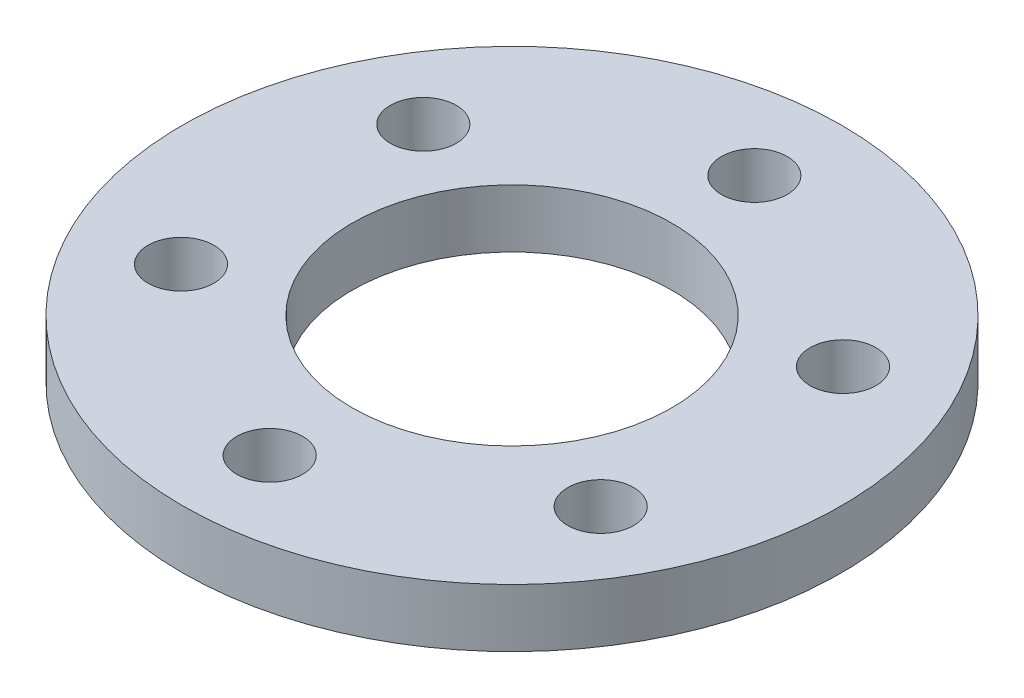
ISO-10303-21;
HEADER;
FILE_DESCRIPTION(('STEP AP214'),'2;1');
FILE_NAME('part.step','',(''),(''),'','','');
FILE_SCHEMA(('AUTOMOTIVE_DESIGN { 1 0 10303 214 1 1 1 1 }'));
ENDSEC;
DATA;
#1=APPLICATION_CONTEXT('core data for automotive mechanical design processes');
#2=APPLICATION_PROTOCOL_DEFINITION('international standard','automotive_design',2000,#1);
#3=PRODUCT_CONTEXT('',#1,'mechanical');
#4=PRODUCT('Part','Part','',(#3));
#5=PRODUCT_RELATED_PRODUCT_CATEGORY('part','',(#4));
#6=PRODUCT_DEFINITION_FORMATION('','',#4);
#7=PRODUCT_DEFINITION_CONTEXT('part definition',#1,'design');
#8=PRODUCT_DEFINITION('design','',#6,#7);
#9=PRODUCT_DEFINITION_SHAPE('','',#8);
#10=(LENGTH_UNIT() NAMED_UNIT(*) SI_UNIT(.MILLI.,.METRE.));
#11=(NAMED_UNIT(*) PLANE_ANGLE_UNIT() SI_UNIT($,.RADIAN.));
#12=(NAMED_UNIT(*) SI_UNIT($,.STERADIAN.) SOLID_ANGLE_UNIT());
#13=UNCERTAINTY_MEASURE_WITH_UNIT(LENGTH_MEASURE(1.E-05),#10,'distance_accuracy_value','');
#14=(GEOMETRIC_REPRESENTATION_CONTEXT(3) GLOBAL_UNCERTAINTY_ASSIGNED_CONTEXT((#13)) GLOBAL_UNIT_ASSIGNED_CONTEXT((#10,
#11,#12)) REPRESENTATION_CONTEXT('',''));
#15=CARTESIAN_POINT('',(0.,0.,0.));
#16=DIRECTION('',(0.,0.,1.));
#17=DIRECTION('',(1.,0.,0.));
#18=AXIS2_PLACEMENT_3D('',#15,#16,#17);
#19=CARTESIAN_POINT('',(0.,3.,0.));
#20=DIRECTION('',(0.,1.,0.));
#21=DIRECTION('',(0.,0.,1.));
#22=AXIS2_PLACEMENT_3D('',#19,#20,#21);
#23=PLANE('',#22);
#24=CARTESIAN_POINT('',(-10.8253175473046,3.,6.25000000000052));
#25=DIRECTION('',(0.,1.,0.));
#26=DIRECTION('',(0.,0.,1.));
#27=AXIS2_PLACEMENT_3D('',#24,#25,#26);
#28=CIRCLE('',#27,1.7);
#29=CARTESIAN_POINT('',(-10.8253175473046,3.,7.95000000000052));
#30=VERTEX_POINT('',#29);
#31=EDGE_CURVE('E87',#30,#30,#28,.T.);
#32=ORIENTED_EDGE('',*,*,#31,.F.);
#33=EDGE_LOOP('',(#32));
#34=FACE_BOUND('',#33,.T.);
#35=CARTESIAN_POINT('',(10.8253175473064,3.,6.24999999999948));
#36=DIRECTION('',(0.,1.,0.));
#37=DIRECTION('',(0.,0.,1.));
#38=AXIS2_PLACEMENT_3D('',#35,#36,#37);
#39=CIRCLE('',#38,1.7);
#40=CARTESIAN_POINT('',(10.8253175473064,3.,7.94999999999948));
#41=VERTEX_POINT('',#40);
#42=EDGE_CURVE('E72',#41,#41,#39,.T.);
#43=ORIENTED_EDGE('',*,*,#42,.F.);
#44=EDGE_LOOP('',(#43));
#45=FACE_BOUND('',#44,.T.);
#46=CARTESIAN_POINT('',(0.,3.,-12.5));
#47=DIRECTION('',(0.,1.,0.));
#48=DIRECTION('',(0.,0.,1.));
#49=AXIS2_PLACEMENT_3D('',#46,#47,#48);
#50=CIRCLE('',#49,1.7);
#51=CARTESIAN_POINT('',(0.,3.,-10.8));
#52=VERTEX_POINT('',#51);
#53=EDGE_CURVE('E56',#52,#52,#50,.T.);
#54=ORIENTED_EDGE('',*,*,#53,.F.);
#55=EDGE_LOOP('',(#54));
#56=FACE_BOUND('',#55,.T.);
#57=CARTESIAN_POINT('',(0.,3.,0.));
#58=DIRECTION('',(0.,1.,0.));
#59=DIRECTION('',(0.,0.,1.));
#60=AXIS2_PLACEMENT_3D('',#57,#58,#59);
#61=CIRCLE('',#60,17.);
#62=CARTESIAN_POINT('',(0.,3.,17.));
#63=VERTEX_POINT('',#62);
#64=EDGE_CURVE('E10',#63,#63,#61,.T.);
#65=ORIENTED_EDGE('',*,*,#64,.T.);
#66=EDGE_LOOP('',(#65));
#67=FACE_BOUND('',#66,.T.);
#68=CARTESIAN_POINT('',(0.,3.,0.));
#69=DIRECTION('',(0.,1.,0.));
#70=DIRECTION('',(0.,0.,1.));
#71=AXIS2_PLACEMENT_3D('',#68,#69,#70);
#72=CIRCLE('',#71,8.25);
#73=CARTESIAN_POINT('',(0.,3.,8.25));
#74=VERTEX_POINT('',#73);
#75=EDGE_CURVE('E50',#74,#74,#72,.T.);
#76=ORIENTED_EDGE('',*,*,#75,.F.);
#77=EDGE_LOOP('',(#76));
#78=FACE_BOUND('',#77,.T.);
#79=CARTESIAN_POINT('',(10.8253175473058,3.,-6.25000000000052));
#80=DIRECTION('',(0.,1.,0.));
#81=DIRECTION('',(0.,0.,1.));
#82=AXIS2_PLACEMENT_3D('',#79,#80,#81);
#83=CIRCLE('',#82,1.7);
#84=CARTESIAN_POINT('',(10.8253175473058,3.,-4.55000000000052));
#85=VERTEX_POINT('',#84);
#86=EDGE_CURVE('E64',#85,#85,#83,.T.);
#87=ORIENTED_EDGE('',*,*,#86,.F.);
#88=EDGE_LOOP('',(#87));
#89=FACE_BOUND('',#88,.T.);
#90=CARTESIAN_POINT('',(1.18838458250068E-12,3.,12.5));
#91=DIRECTION('',(0.,1.,0.));
#92=DIRECTION('',(0.,0.,1.));
#93=AXIS2_PLACEMENT_3D('',#90,#91,#92);
#94=CIRCLE('',#93,1.7);
#95=CARTESIAN_POINT('',(1.18838458250068E-12,3.,14.2));
#96=VERTEX_POINT('',#95);
#97=EDGE_CURVE('E80',#96,#96,#94,.T.);
#98=ORIENTED_EDGE('',*,*,#97,.F.);
#99=EDGE_LOOP('',(#98));
#100=FACE_BOUND('',#99,.T.);
#101=CARTESIAN_POINT('',(-10.8253175473052,3.,-6.24999999999948));
#102=DIRECTION('',(0.,1.,0.));
#103=DIRECTION('',(0.,0.,1.));
#104=AXIS2_PLACEMENT_3D('',#101,#102,#103);
#105=CIRCLE('',#104,1.7);
#106=CARTESIAN_POINT('',(-10.8253175473052,3.,-4.54999999999948));
#107=VERTEX_POINT('',#106);
#108=EDGE_CURVE('E94',#107,#107,#105,.T.);
#109=ORIENTED_EDGE('',*,*,#108,.F.);
#110=EDGE_LOOP('',(#109));
#111=FACE_BOUND('',#110,.T.);
#112=ADVANCED_FACE('F35',(#34,#45,#56,#67,#78,#89,#100,#111),#23,.T.);
#113=CARTESIAN_POINT('',(0.,0.,0.));
#114=DIRECTION('',(0.,1.,0.));
#115=DIRECTION('',(0.,0.,1.));
#116=AXIS2_PLACEMENT_3D('',#113,#114,#115);
#117=PLANE('',#116);
#118=CARTESIAN_POINT('',(0.,0.,0.));
#119=DIRECTION('',(0.,1.,0.));
#120=DIRECTION('',(0.,0.,1.));
#121=AXIS2_PLACEMENT_3D('',#118,#119,#120);
#122=CIRCLE('',#121,17.);
#123=CARTESIAN_POINT('',(0.,0.,17.));
#124=VERTEX_POINT('',#123);
#125=EDGE_CURVE('E39',#124,#124,#122,.T.);
#126=ORIENTED_EDGE('',*,*,#125,.F.);
#127=EDGE_LOOP('',(#126));
#128=FACE_BOUND('',#127,.T.);
#129=CARTESIAN_POINT('',(0.,0.,0.));
#130=DIRECTION('',(0.,1.,0.));
#131=DIRECTION('',(0.,0.,1.));
#132=AXIS2_PLACEMENT_3D('',#129,#130,#131);
#133=CIRCLE('',#132,8.25);
#134=CARTESIAN_POINT('',(0.,0.,8.25));
#135=VERTEX_POINT('',#134);
#136=EDGE_CURVE('E52',#135,#135,#133,.T.);
#137=ORIENTED_EDGE('',*,*,#136,.T.);
#138=EDGE_LOOP('',(#137));
#139=FACE_BOUND('',#138,.T.);
#140=CARTESIAN_POINT('',(0.,0.,-12.5));
#141=DIRECTION('',(0.,1.,0.));
#142=DIRECTION('',(0.,0.,1.));
#143=AXIS2_PLACEMENT_3D('',#140,#141,#142);
#144=CIRCLE('',#143,1.7);
#145=CARTESIAN_POINT('',(0.,0.,-10.8));
#146=VERTEX_POINT('',#145);
#147=EDGE_CURVE('E60',#146,#146,#144,.T.);
#148=ORIENTED_EDGE('',*,*,#147,.T.);
#149=EDGE_LOOP('',(#148));
#150=FACE_BOUND('',#149,.T.);
#151=CARTESIAN_POINT('',(10.8253175473058,0.,-6.25000000000052));
#152=DIRECTION('',(0.,1.,0.));
#153=DIRECTION('',(0.,0.,1.));
#154=AXIS2_PLACEMENT_3D('',#151,#152,#153);
#155=CIRCLE('',#154,1.7);
#156=CARTESIAN_POINT('',(10.8253175473058,0.,-4.55000000000052));
#157=VERTEX_POINT('',#156);
#158=EDGE_CURVE('E68',#157,#157,#155,.T.);
#159=ORIENTED_EDGE('',*,*,#158,.T.);
#160=EDGE_LOOP('',(#159));
#161=FACE_BOUND('',#160,.T.);
#162=CARTESIAN_POINT('',(10.8253175473064,0.,6.24999999999948));
#163=DIRECTION('',(0.,1.,0.));
#164=DIRECTION('',(0.,0.,1.));
#165=AXIS2_PLACEMENT_3D('',#162,#163,#164);
#166=CIRCLE('',#165,1.7);
#167=CARTESIAN_POINT('',(10.8253175473064,0.,7.94999999999948));
#168=VERTEX_POINT('',#167);
#169=EDGE_CURVE('E76',#168,#168,#166,.T.);
#170=ORIENTED_EDGE('',*,*,#169,.T.);
#171=EDGE_LOOP('',(#170));
#172=FACE_BOUND('',#171,.T.);
#173=CARTESIAN_POINT('',(1.18838458250068E-12,0.,12.5));
#174=DIRECTION('',(0.,1.,0.));
#175=DIRECTION('',(0.,0.,1.));
#176=AXIS2_PLACEMENT_3D('',#173,#174,#175);
#177=CIRCLE('',#176,1.7);
#178=CARTESIAN_POINT('',(1.18838458250068E-12,0.,14.2));
#179=VERTEX_POINT('',#178);
#180=EDGE_CURVE('E84',#179,#179,#177,.T.);
#181=ORIENTED_EDGE('',*,*,#180,.T.);
#182=EDGE_LOOP('',(#181));
#183=FACE_BOUND('',#182,.T.);
#184=CARTESIAN_POINT('',(-10.8253175473046,0.,6.25000000000052));
#185=DIRECTION('',(0.,1.,0.));
#186=DIRECTION('',(0.,0.,1.));
#187=AXIS2_PLACEMENT_3D('',#184,#185,#186);
#188=CIRCLE('',#187,1.7);
#189=CARTESIAN_POINT('',(-10.8253175473046,0.,7.95000000000052));
#190=VERTEX_POINT('',#189);
#191=EDGE_CURVE('E91',#190,#190,#188,.T.);
#192=ORIENTED_EDGE('',*,*,#191,.T.);
#193=EDGE_LOOP('',(#192));
#194=FACE_BOUND('',#193,.T.);
#195=CARTESIAN_POINT('',(-10.8253175473052,0.,-6.24999999999948));
#196=DIRECTION('',(0.,1.,0.));
#197=DIRECTION('',(0.,0.,1.));
#198=AXIS2_PLACEMENT_3D('',#195,#196,#197);
#199=CIRCLE('',#198,1.7);
#200=CARTESIAN_POINT('',(-10.8253175473052,0.,-4.54999999999948));
#201=VERTEX_POINT('',#200);
#202=EDGE_CURVE('E98',#201,#201,#199,.T.);
#203=ORIENTED_EDGE('',*,*,#202,.T.);
#204=EDGE_LOOP('',(#203));
#205=FACE_BOUND('',#204,.T.);
#206=ADVANCED_FACE('F110',(#128,#139,#150,#161,#172,#183,#194,#205),#117,.F.);
#207=CARTESIAN_POINT('',(0.,3.,0.));
#208=DIRECTION('',(0.,-1.,0.));
#209=DIRECTION('',(0.,0.,-1.));
#210=AXIS2_PLACEMENT_3D('',#207,#208,#209);
#211=CYLINDRICAL_SURFACE('',#210,17.);
#212=ORIENTED_EDGE('',*,*,#64,.F.);
#213=EDGE_LOOP('',(#212));
#214=FACE_BOUND('',#213,.T.);
#215=ORIENTED_EDGE('',*,*,#125,.T.);
#216=EDGE_LOOP('',(#215));
#217=FACE_BOUND('',#216,.T.);
#218=ADVANCED_FACE('F37',(#214,#217),#211,.T.);
#219=CARTESIAN_POINT('',(0.,3.,0.));
#220=DIRECTION('',(0.,-1.,0.));
#221=DIRECTION('',(0.,0.,-1.));
#222=AXIS2_PLACEMENT_3D('',#219,#220,#221);
#223=CYLINDRICAL_SURFACE('',#222,8.25);
#224=ORIENTED_EDGE('',*,*,#75,.T.);
#225=EDGE_LOOP('',(#224));
#226=FACE_BOUND('',#225,.T.);
#227=ORIENTED_EDGE('',*,*,#136,.F.);
#228=EDGE_LOOP('',(#227));
#229=FACE_BOUND('',#228,.T.);
#230=ADVANCED_FACE('F120',(#226,#229),#223,.F.);
#231=CARTESIAN_POINT('',(0.,3.,-12.5));
#232=DIRECTION('',(0.,-1.,0.));
#233=DIRECTION('',(0.,0.,-1.));
#234=AXIS2_PLACEMENT_3D('',#231,#232,#233);
#235=CYLINDRICAL_SURFACE('',#234,1.7);
#236=ORIENTED_EDGE('',*,*,#53,.T.);
#237=EDGE_LOOP('',(#236));
#238=FACE_BOUND('',#237,.T.);
#239=ORIENTED_EDGE('',*,*,#147,.F.);
#240=EDGE_LOOP('',(#239));
#241=FACE_BOUND('',#240,.T.);
#242=ADVANCED_FACE('F123',(#238,#241),#235,.F.);
#243=CARTESIAN_POINT('',(10.8253175473058,3.,-6.25000000000052));
#244=DIRECTION('',(0.,-1.,0.));
#245=DIRECTION('',(0.,0.,-1.));
#246=AXIS2_PLACEMENT_3D('',#243,#244,#245);
#247=CYLINDRICAL_SURFACE('',#246,1.7);
#248=ORIENTED_EDGE('',*,*,#86,.T.);
#249=EDGE_LOOP('',(#248));
#250=FACE_BOUND('',#249,.T.);
#251=ORIENTED_EDGE('',*,*,#158,.F.);
#252=EDGE_LOOP('',(#251));
#253=FACE_BOUND('',#252,.T.);
#254=ADVANCED_FACE('F127',(#250,#253),#247,.F.);
#255=CARTESIAN_POINT('',(10.8253175473064,3.,6.24999999999948));
#256=DIRECTION('',(0.,-1.,0.));
#257=DIRECTION('',(0.,0.,-1.));
#258=AXIS2_PLACEMENT_3D('',#255,#256,#257);
#259=CYLINDRICAL_SURFACE('',#258,1.7);
#260=ORIENTED_EDGE('',*,*,#42,.T.);
#261=EDGE_LOOP('',(#260));
#262=FACE_BOUND('',#261,.T.);
#263=ORIENTED_EDGE('',*,*,#169,.F.);
#264=EDGE_LOOP('',(#263));
#265=FACE_BOUND('',#264,.T.);
#266=ADVANCED_FACE('F131',(#262,#265),#259,.F.);
#267=CARTESIAN_POINT('',(1.18838458250068E-12,3.,12.5));
#268=DIRECTION('',(0.,-1.,0.));
#269=DIRECTION('',(0.,0.,-1.));
#270=AXIS2_PLACEMENT_3D('',#267,#268,#269);
#271=CYLINDRICAL_SURFACE('',#270,1.7);
#272=ORIENTED_EDGE('',*,*,#97,.T.);
#273=EDGE_LOOP('',(#272));
#274=FACE_BOUND('',#273,.T.);
#275=ORIENTED_EDGE('',*,*,#180,.F.);
#276=EDGE_LOOP('',(#275));
#277=FACE_BOUND('',#276,.T.);
#278=ADVANCED_FACE('F135',(#274,#277),#271,.F.);
#279=CARTESIAN_POINT('',(-10.8253175473046,3.,6.25000000000052));
#280=DIRECTION('',(0.,-1.,0.));
#281=DIRECTION('',(0.,0.,-1.));
#282=AXIS2_PLACEMENT_3D('',#279,#280,#281);
#283=CYLINDRICAL_SURFACE('',#282,1.7);
#284=ORIENTED_EDGE('',*,*,#31,.T.);
#285=EDGE_LOOP('',(#284));
#286=FACE_BOUND('',#285,.T.);
#287=ORIENTED_EDGE('',*,*,#191,.F.);
#288=EDGE_LOOP('',(#287));
#289=FACE_BOUND('',#288,.T.);
#290=ADVANCED_FACE('F139',(#286,#289),#283,.F.);
#291=CARTESIAN_POINT('',(-10.8253175473052,3.,-6.24999999999948));
#292=DIRECTION('',(0.,-1.,0.));
#293=DIRECTION('',(0.,0.,-1.));
#294=AXIS2_PLACEMENT_3D('',#291,#292,#293);
#295=CYLINDRICAL_SURFACE('',#294,1.7);
#296=ORIENTED_EDGE('',*,*,#108,.T.);
#297=EDGE_LOOP('',(#296));
#298=FACE_BOUND('',#297,.T.);
#299=ORIENTED_EDGE('',*,*,#202,.F.);
#300=EDGE_LOOP('',(#299));
#301=FACE_BOUND('',#300,.T.);
#302=ADVANCED_FACE('F106',(#298,#301),#295,.F.);
#303=CLOSED_SHELL('',(#112,#206,#218,#230,#242,#254,#266,#278,#290,#302));
#304=MANIFOLD_SOLID_BREP('B2',#303);
#305=ADVANCED_BREP_SHAPE_REPRESENTATION('',(#18,#304),#14);
#306=SHAPE_DEFINITION_REPRESENTATION(#9,#305);
ENDSEC;
END-ISO-10303-21;
